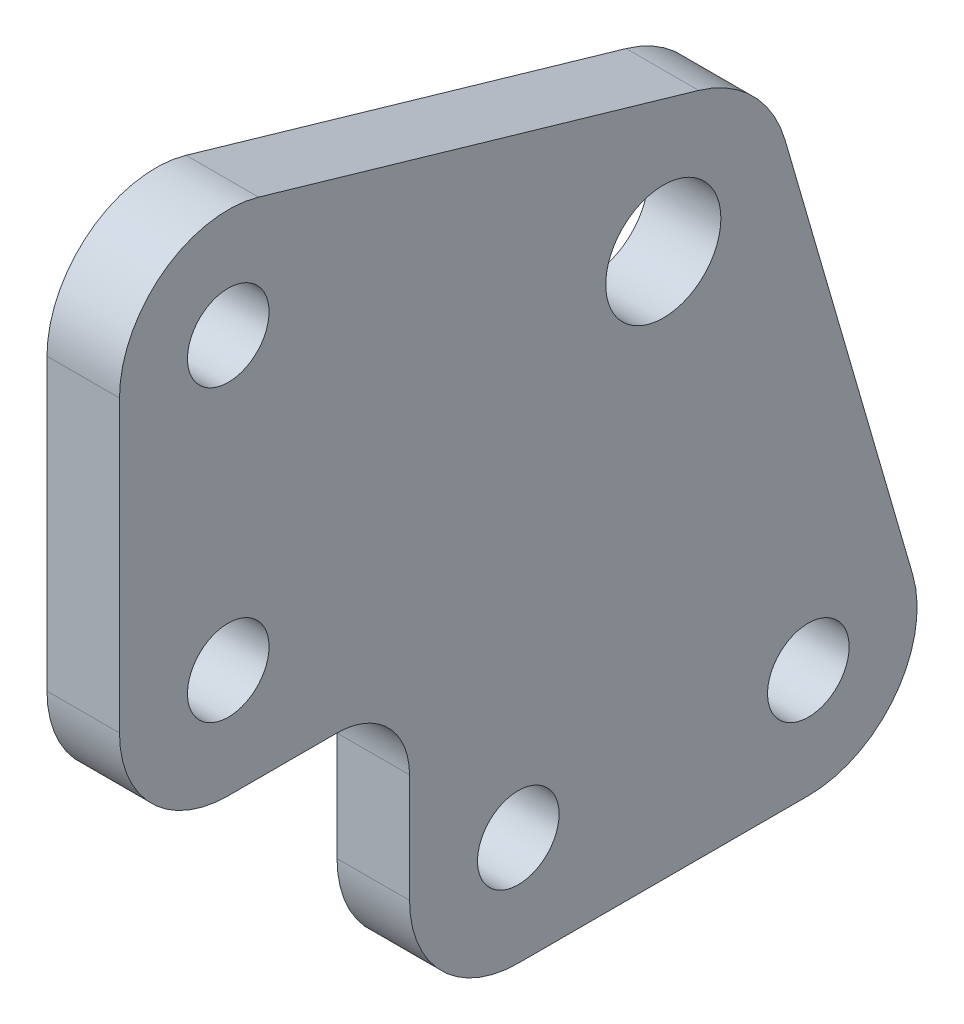
ISO-10303-21;
HEADER;
FILE_DESCRIPTION(('STEP AP214'),'2;1');
FILE_NAME('part.step','',(''),(''),'','','');
FILE_SCHEMA(('AUTOMOTIVE_DESIGN { 1 0 10303 214 1 1 1 1 }'));
ENDSEC;
DATA;
#1=APPLICATION_CONTEXT('core data for automotive mechanical design processes');
#2=APPLICATION_PROTOCOL_DEFINITION('international standard','automotive_design',2000,#1);
#3=PRODUCT_CONTEXT('',#1,'mechanical');
#4=PRODUCT('Part','Part','',(#3));
#5=PRODUCT_RELATED_PRODUCT_CATEGORY('part','',(#4));
#6=PRODUCT_DEFINITION_FORMATION('','',#4);
#7=PRODUCT_DEFINITION_CONTEXT('part definition',#1,'design');
#8=PRODUCT_DEFINITION('design','',#6,#7);
#9=PRODUCT_DEFINITION_SHAPE('','',#8);
#10=(LENGTH_UNIT() NAMED_UNIT(*) SI_UNIT(.MILLI.,.METRE.));
#11=(NAMED_UNIT(*) PLANE_ANGLE_UNIT() SI_UNIT($,.RADIAN.));
#12=(NAMED_UNIT(*) SI_UNIT($,.STERADIAN.) SOLID_ANGLE_UNIT());
#13=UNCERTAINTY_MEASURE_WITH_UNIT(LENGTH_MEASURE(1.E-05),#10,'distance_accuracy_value','');
#14=(GEOMETRIC_REPRESENTATION_CONTEXT(3) GLOBAL_UNCERTAINTY_ASSIGNED_CONTEXT((#13)) GLOBAL_UNIT_ASSIGNED_CONTEXT((#10,
#11,#12)) REPRESENTATION_CONTEXT('',''));
#15=CARTESIAN_POINT('',(0.,0.,0.));
#16=DIRECTION('',(0.,0.,1.));
#17=DIRECTION('',(1.,0.,0.));
#18=AXIS2_PLACEMENT_3D('',#15,#16,#17);
#19=CARTESIAN_POINT('',(18.738912484,195.704574554,1328.475334154));
#20=DIRECTION('',(-1.,0.,0.));
#21=DIRECTION('',(0.,0.,1.));
#22=AXIS2_PLACEMENT_3D('',#19,#20,#21);
#23=CYLINDRICAL_SURFACE('',#22,9.52500000000001);
#24=CARTESIAN_POINT('',(12.388912484,195.704574554,1328.475334154));
#25=DIRECTION('',(1.,0.,0.));
#26=DIRECTION('',(0.,0.,-1.));
#27=AXIS2_PLACEMENT_3D('',#24,#25,#26);
#28=CIRCLE('',#27,9.52500000000001);
#29=CARTESIAN_POINT('',(12.388912484,204.85278317032,1325.82280628189));
#30=VERTEX_POINT('',#29);
#31=CARTESIAN_POINT('',(12.388912484,195.704574554,1338.000334154));
#32=VERTEX_POINT('',#31);
#33=EDGE_CURVE('E151',#30,#32,#28,.T.);
#34=ORIENTED_EDGE('',*,*,#33,.T.);
#35=DIRECTION('',(-1.,0.,0.));
#36=VECTOR('',#35,1.);
#37=CARTESIAN_POINT('',(18.738912484,195.704574554,1338.000334154));
#38=LINE('',#37,#36);
#39=CARTESIAN_POINT('',(18.738912484,195.704574554,1338.000334154));
#40=VERTEX_POINT('',#39);
#41=EDGE_CURVE('E132',#40,#32,#38,.T.);
#42=ORIENTED_EDGE('',*,*,#41,.F.);
#43=CARTESIAN_POINT('',(18.738912484,195.704574554,1328.475334154));
#44=DIRECTION('',(1.,0.,0.));
#45=DIRECTION('',(0.,0.,-1.));
#46=AXIS2_PLACEMENT_3D('',#43,#44,#45);
#47=CIRCLE('',#46,9.52500000000001);
#48=CARTESIAN_POINT('',(18.738912484,204.85278317032,1325.82280628189));
#49=VERTEX_POINT('',#48);
#50=EDGE_CURVE('E139',#49,#40,#47,.T.);
#51=ORIENTED_EDGE('',*,*,#50,.F.);
#52=DIRECTION('',(-1.,0.,0.));
#53=VECTOR('',#52,1.);
#54=CARTESIAN_POINT('',(18.738912484,204.85278317032,1325.82280628189));
#55=LINE('',#54,#53);
#56=EDGE_CURVE('E180',#49,#30,#55,.T.);
#57=ORIENTED_EDGE('',*,*,#56,.T.);
#58=EDGE_LOOP('',(#34,#42,#51,#57));
#59=FACE_BOUND('',#58,.T.);
#60=ADVANCED_FACE('F39',(#59),#23,.T.);
#61=CARTESIAN_POINT('',(18.738912484,195.704574554,1338.000334154));
#62=DIRECTION('',(0.,0.,-1.));
#63=DIRECTION('',(-1.,0.,0.));
#64=AXIS2_PLACEMENT_3D('',#61,#62,#63);
#65=PLANE('',#64);
#66=DIRECTION('',(0.,-1.,0.));
#67=VECTOR('',#66,1.);
#68=CARTESIAN_POINT('',(12.388912484,195.704574554,1338.000334154));
#69=LINE('',#68,#67);
#70=CARTESIAN_POINT('',(12.388912484,170.304574554,1338.000334154));
#71=VERTEX_POINT('',#70);
#72=EDGE_CURVE('E199',#32,#71,#69,.T.);
#73=ORIENTED_EDGE('',*,*,#72,.T.);
#74=DIRECTION('',(-1.,0.,0.));
#75=VECTOR('',#74,1.);
#76=CARTESIAN_POINT('',(18.738912484,170.304574554,1338.000334154));
#77=LINE('',#76,#75);
#78=CARTESIAN_POINT('',(18.738912484,170.304574554,1338.000334154));
#79=VERTEX_POINT('',#78);
#80=EDGE_CURVE('E135',#79,#71,#77,.T.);
#81=ORIENTED_EDGE('',*,*,#80,.F.);
#82=DIRECTION('',(0.,-1.,0.));
#83=VECTOR('',#82,1.);
#84=CARTESIAN_POINT('',(18.738912484,195.704574554,1338.000334154));
#85=LINE('',#84,#83);
#86=EDGE_CURVE('E128',#40,#79,#85,.T.);
#87=ORIENTED_EDGE('',*,*,#86,.F.);
#88=ORIENTED_EDGE('',*,*,#41,.T.);
#89=EDGE_LOOP('',(#73,#81,#87,#88));
#90=FACE_BOUND('',#89,.T.);
#91=ADVANCED_FACE('F130',(#90),#65,.F.);
#92=CARTESIAN_POINT('',(18.738912484,170.304574554,1328.475334154));
#93=DIRECTION('',(-1.,0.,0.));
#94=DIRECTION('',(0.,0.,1.));
#95=AXIS2_PLACEMENT_3D('',#92,#93,#94);
#96=CYLINDRICAL_SURFACE('',#95,9.52499999999999);
#97=CARTESIAN_POINT('',(12.388912484,170.304574554,1328.475334154));
#98=DIRECTION('',(1.,0.,0.));
#99=DIRECTION('',(0.,0.,-1.));
#100=AXIS2_PLACEMENT_3D('',#97,#98,#99);
#101=CIRCLE('',#100,9.52499999999999);
#102=CARTESIAN_POINT('',(12.388912484,160.779574554,1328.475334154));
#103=VERTEX_POINT('',#102);
#104=EDGE_CURVE('E197',#71,#103,#101,.T.);
#105=ORIENTED_EDGE('',*,*,#104,.T.);
#106=DIRECTION('',(-1.,0.,0.));
#107=VECTOR('',#106,1.);
#108=CARTESIAN_POINT('',(18.738912484,160.779574554,1328.475334154));
#109=LINE('',#108,#107);
#110=CARTESIAN_POINT('',(18.738912484,160.779574554,1328.475334154));
#111=VERTEX_POINT('',#110);
#112=EDGE_CURVE('E156',#111,#103,#109,.T.);
#113=ORIENTED_EDGE('',*,*,#112,.F.);
#114=CARTESIAN_POINT('',(18.738912484,170.304574554,1328.475334154));
#115=DIRECTION('',(1.,0.,0.));
#116=DIRECTION('',(0.,0.,-1.));
#117=AXIS2_PLACEMENT_3D('',#114,#115,#116);
#118=CIRCLE('',#117,9.52499999999999);
#119=EDGE_CURVE('E138',#79,#111,#118,.T.);
#120=ORIENTED_EDGE('',*,*,#119,.F.);
#121=ORIENTED_EDGE('',*,*,#80,.T.);
#122=EDGE_LOOP('',(#105,#113,#120,#121));
#123=FACE_BOUND('',#122,.T.);
#124=ADVANCED_FACE('F284',(#123),#96,.T.);
#125=CARTESIAN_POINT('',(18.738912484,160.779574554,1328.475334154));
#126=DIRECTION('',(0.,1.,0.));
#127=DIRECTION('',(0.,0.,1.));
#128=AXIS2_PLACEMENT_3D('',#125,#126,#127);
#129=PLANE('',#128);
#130=DIRECTION('',(0.,0.,-1.));
#131=VECTOR('',#130,1.);
#132=CARTESIAN_POINT('',(12.388912484,160.779574554,1328.475334154));
#133=LINE('',#132,#131);
#134=CARTESIAN_POINT('',(12.388912484,160.779574554,1318.950334154));
#135=VERTEX_POINT('',#134);
#136=EDGE_CURVE('E195',#103,#135,#133,.T.);
#137=ORIENTED_EDGE('',*,*,#136,.T.);
#138=DIRECTION('',(-1.,0.,0.));
#139=VECTOR('',#138,1.);
#140=CARTESIAN_POINT('',(18.738912484,160.779574554,1318.950334154));
#141=LINE('',#140,#139);
#142=CARTESIAN_POINT('',(18.738912484,160.779574554,1318.950334154));
#143=VERTEX_POINT('',#142);
#144=EDGE_CURVE('E54',#135,#143,#141,.F.);
#145=ORIENTED_EDGE('',*,*,#144,.T.);
#146=DIRECTION('',(0.,0.,-1.));
#147=VECTOR('',#146,1.);
#148=CARTESIAN_POINT('',(18.738912484,160.779574554,1328.475334154));
#149=LINE('',#148,#147);
#150=EDGE_CURVE('E216',#111,#143,#149,.T.);
#151=ORIENTED_EDGE('',*,*,#150,.F.);
#152=ORIENTED_EDGE('',*,*,#112,.T.);
#153=EDGE_LOOP('',(#137,#145,#151,#152));
#154=FACE_BOUND('',#153,.T.);
#155=ADVANCED_FACE('F289',(#154),#129,.F.);
#156=CARTESIAN_POINT('',(18.738912484,160.779574554,1312.600334154));
#157=DIRECTION('',(0.,0.,-1.));
#158=DIRECTION('',(-1.,0.,0.));
#159=AXIS2_PLACEMENT_3D('',#156,#157,#158);
#160=PLANE('',#159);
#161=DIRECTION('',(0.,-1.,0.));
#162=VECTOR('',#161,1.);
#163=CARTESIAN_POINT('',(18.738912484,160.779574554,1312.600334154));
#164=LINE('',#163,#162);
#165=CARTESIAN_POINT('',(18.738912484,154.429574554,1312.600334154));
#166=VERTEX_POINT('',#165);
#167=CARTESIAN_POINT('',(18.738912484,144.904574554,1312.600334154));
#168=VERTEX_POINT('',#167);
#169=EDGE_CURVE('E214',#166,#168,#164,.T.);
#170=ORIENTED_EDGE('',*,*,#169,.F.);
#171=DIRECTION('',(-1.,0.,0.));
#172=VECTOR('',#171,1.);
#173=CARTESIAN_POINT('',(12.388912484,154.429574554,1312.600334154));
#174=LINE('',#173,#172);
#175=CARTESIAN_POINT('',(12.388912484,154.429574554,1312.600334154));
#176=VERTEX_POINT('',#175);
#177=EDGE_CURVE('E152',#166,#176,#174,.T.);
#178=ORIENTED_EDGE('',*,*,#177,.T.);
#179=DIRECTION('',(0.,-1.,0.));
#180=VECTOR('',#179,1.);
#181=CARTESIAN_POINT('',(12.388912484,160.779574554,1312.600334154));
#182=LINE('',#181,#180);
#183=CARTESIAN_POINT('',(12.388912484,144.904574554,1312.600334154));
#184=VERTEX_POINT('',#183);
#185=EDGE_CURVE('E193',#176,#184,#182,.T.);
#186=ORIENTED_EDGE('',*,*,#185,.T.);
#187=DIRECTION('',(-1.,0.,0.));
#188=VECTOR('',#187,1.);
#189=CARTESIAN_POINT('',(18.738912484,144.904574554,1312.600334154));
#190=LINE('',#189,#188);
#191=EDGE_CURVE('E162',#168,#184,#190,.T.);
#192=ORIENTED_EDGE('',*,*,#191,.F.);
#193=EDGE_LOOP('',(#170,#178,#186,#192));
#194=FACE_BOUND('',#193,.T.);
#195=ADVANCED_FACE('F293',(#194),#160,.F.);
#196=CARTESIAN_POINT('',(18.738912484,144.904574554,1303.075334154));
#197=DIRECTION('',(-1.,0.,0.));
#198=DIRECTION('',(0.,0.,1.));
#199=AXIS2_PLACEMENT_3D('',#196,#197,#198);
#200=CYLINDRICAL_SURFACE('',#199,9.52500000000001);
#201=CARTESIAN_POINT('',(12.388912484,144.904574554,1303.075334154));
#202=DIRECTION('',(1.,0.,0.));
#203=DIRECTION('',(0.,0.,-1.));
#204=AXIS2_PLACEMENT_3D('',#201,#202,#203);
#205=CIRCLE('',#204,9.52500000000001);
#206=CARTESIAN_POINT('',(12.388912484,135.379574554,1303.075334154));
#207=VERTEX_POINT('',#206);
#208=EDGE_CURVE('E191',#184,#207,#205,.T.);
#209=ORIENTED_EDGE('',*,*,#208,.T.);
#210=DIRECTION('',(-1.,0.,0.));
#211=VECTOR('',#210,1.);
#212=CARTESIAN_POINT('',(18.738912484,135.379574554,1303.075334154));
#213=LINE('',#212,#211);
#214=CARTESIAN_POINT('',(18.738912484,135.379574554,1303.075334154));
#215=VERTEX_POINT('',#214);
#216=EDGE_CURVE('E165',#215,#207,#213,.T.);
#217=ORIENTED_EDGE('',*,*,#216,.F.);
#218=CARTESIAN_POINT('',(18.738912484,144.904574554,1303.075334154));
#219=DIRECTION('',(1.,0.,0.));
#220=DIRECTION('',(0.,0.,-1.));
#221=AXIS2_PLACEMENT_3D('',#218,#219,#220);
#222=CIRCLE('',#221,9.52500000000001);
#223=EDGE_CURVE('E212',#168,#215,#222,.T.);
#224=ORIENTED_EDGE('',*,*,#223,.F.);
#225=ORIENTED_EDGE('',*,*,#191,.T.);
#226=EDGE_LOOP('',(#209,#217,#224,#225));
#227=FACE_BOUND('',#226,.T.);
#228=ADVANCED_FACE('F296',(#227),#200,.T.);
#229=CARTESIAN_POINT('',(18.738912484,135.379574554,1303.075334154));
#230=DIRECTION('',(0.,1.,0.));
#231=DIRECTION('',(0.,0.,1.));
#232=AXIS2_PLACEMENT_3D('',#229,#230,#231);
#233=PLANE('',#232);
#234=DIRECTION('',(0.,0.,-1.));
#235=VECTOR('',#234,1.);
#236=CARTESIAN_POINT('',(12.388912484,135.379574554,1303.075334154));
#237=LINE('',#236,#235);
#238=CARTESIAN_POINT('',(12.388912484,135.379574554,1277.675334154));
#239=VERTEX_POINT('',#238);
#240=EDGE_CURVE('E189',#207,#239,#237,.T.);
#241=ORIENTED_EDGE('',*,*,#240,.T.);
#242=DIRECTION('',(-1.,0.,0.));
#243=VECTOR('',#242,1.);
#244=CARTESIAN_POINT('',(18.738912484,135.379574554,1277.675334154));
#245=LINE('',#244,#243);
#246=CARTESIAN_POINT('',(18.738912484,135.379574554,1277.675334154));
#247=VERTEX_POINT('',#246);
#248=EDGE_CURVE('E168',#247,#239,#245,.T.);
#249=ORIENTED_EDGE('',*,*,#248,.F.);
#250=DIRECTION('',(0.,0.,-1.));
#251=VECTOR('',#250,1.);
#252=CARTESIAN_POINT('',(18.738912484,135.379574554,1303.075334154));
#253=LINE('',#252,#251);
#254=EDGE_CURVE('E210',#215,#247,#253,.T.);
#255=ORIENTED_EDGE('',*,*,#254,.F.);
#256=ORIENTED_EDGE('',*,*,#216,.T.);
#257=EDGE_LOOP('',(#241,#249,#255,#256));
#258=FACE_BOUND('',#257,.T.);
#259=ADVANCED_FACE('F300',(#258),#233,.F.);
#260=CARTESIAN_POINT('',(18.738912484,144.904574554,1277.675334154));
#261=DIRECTION('',(-1.,0.,0.));
#262=DIRECTION('',(0.,0.,1.));
#263=AXIS2_PLACEMENT_3D('',#260,#261,#262);
#264=CYLINDRICAL_SURFACE('',#263,9.52499999999996);
#265=CARTESIAN_POINT('',(12.388912484,144.904574554,1277.675334154));
#266=DIRECTION('',(1.,0.,0.));
#267=DIRECTION('',(0.,0.,-1.));
#268=AXIS2_PLACEMENT_3D('',#265,#266,#267);
#269=CIRCLE('',#268,9.52499999999996);
#270=CARTESIAN_POINT('',(12.388912484,147.557102426107,1268.52712553768));
#271=VERTEX_POINT('',#270);
#272=EDGE_CURVE('E187',#239,#271,#269,.T.);
#273=ORIENTED_EDGE('',*,*,#272,.T.);
#274=DIRECTION('',(-1.,0.,0.));
#275=VECTOR('',#274,1.);
#276=CARTESIAN_POINT('',(18.738912484,147.557102426107,1268.52712553768));
#277=LINE('',#276,#275);
#278=CARTESIAN_POINT('',(18.738912484,147.557102426107,1268.52712553768));
#279=VERTEX_POINT('',#278);
#280=EDGE_CURVE('E171',#279,#271,#277,.T.);
#281=ORIENTED_EDGE('',*,*,#280,.F.);
#282=CARTESIAN_POINT('',(18.738912484,144.904574554,1277.675334154));
#283=DIRECTION('',(1.,0.,0.));
#284=DIRECTION('',(0.,0.,-1.));
#285=AXIS2_PLACEMENT_3D('',#282,#283,#284);
#286=CIRCLE('',#285,9.52499999999996);
#287=EDGE_CURVE('E208',#247,#279,#286,.T.);
#288=ORIENTED_EDGE('',*,*,#287,.F.);
#289=ORIENTED_EDGE('',*,*,#248,.T.);
#290=EDGE_LOOP('',(#273,#281,#288,#289));
#291=FACE_BOUND('',#290,.T.);
#292=ADVANCED_FACE('F304',(#291),#264,.T.);
#293=CARTESIAN_POINT('',(18.738912484,186.099190404791,1279.70242410163));
#294=DIRECTION('',(0.,-0.278480616494109,0.960441849482342));
#295=DIRECTION('',(0.,-0.960441849482342,-0.278480616494109));
#296=AXIS2_PLACEMENT_3D('',#293,#294,#295);
#297=PLANE('',#296);
#298=DIRECTION('',(0.,0.960441849482342,0.278480616494109));
#299=VECTOR('',#298,1.);
#300=CARTESIAN_POINT('',(12.388912484,186.099190404791,1279.70242410163));
#301=LINE('',#300,#299);
#302=CARTESIAN_POINT('',(12.388912484,186.099190404791,1279.70242410163));
#303=VERTEX_POINT('',#302);
#304=EDGE_CURVE('E185',#271,#303,#301,.T.);
#305=ORIENTED_EDGE('',*,*,#304,.T.);
#306=DIRECTION('',(-1.,0.,0.));
#307=VECTOR('',#306,1.);
#308=CARTESIAN_POINT('',(18.738912484,186.099190404791,1279.70242410163));
#309=LINE('',#308,#307);
#310=CARTESIAN_POINT('',(18.738912484,186.099190404791,1279.70242410163));
#311=VERTEX_POINT('',#310);
#312=EDGE_CURVE('E174',#311,#303,#309,.T.);
#313=ORIENTED_EDGE('',*,*,#312,.F.);
#314=DIRECTION('',(0.,0.960441849482342,0.278480616494109));
#315=VECTOR('',#314,1.);
#316=CARTESIAN_POINT('',(18.738912484,186.099190404791,1279.70242410163));
#317=LINE('',#316,#315);
#318=EDGE_CURVE('E206',#279,#311,#317,.T.);
#319=ORIENTED_EDGE('',*,*,#318,.F.);
#320=ORIENTED_EDGE('',*,*,#280,.T.);
#321=EDGE_LOOP('',(#305,#313,#319,#320));
#322=FACE_BOUND('',#321,.T.);
#323=ADVANCED_FACE('F308',(#322),#297,.F.);
#324=CARTESIAN_POINT('',(18.738912484,183.004574554,1290.375334154));
#325=DIRECTION('',(-1.,0.,0.));
#326=DIRECTION('',(0.,0.,1.));
#327=AXIS2_PLACEMENT_3D('',#324,#325,#326);
#328=CYLINDRICAL_SURFACE('',#327,11.1125000000001);
#329=CARTESIAN_POINT('',(12.388912484,183.004574554,1290.375334154));
#330=DIRECTION('',(1.,0.,0.));
#331=DIRECTION('',(0.,0.,-1.));
#332=AXIS2_PLACEMENT_3D('',#329,#330,#331);
#333=CIRCLE('',#332,11.1125000000001);
#334=CARTESIAN_POINT('',(12.388912484,193.677484606373,1287.28071830321));
#335=VERTEX_POINT('',#334);
#336=EDGE_CURVE('E183',#303,#335,#333,.T.);
#337=ORIENTED_EDGE('',*,*,#336,.T.);
#338=DIRECTION('',(-1.,0.,0.));
#339=VECTOR('',#338,1.);
#340=CARTESIAN_POINT('',(18.738912484,193.677484606373,1287.28071830321));
#341=LINE('',#340,#339);
#342=CARTESIAN_POINT('',(18.738912484,193.677484606373,1287.28071830321));
#343=VERTEX_POINT('',#342);
#344=EDGE_CURVE('E177',#343,#335,#341,.T.);
#345=ORIENTED_EDGE('',*,*,#344,.F.);
#346=CARTESIAN_POINT('',(18.738912484,183.004574554,1290.375334154));
#347=DIRECTION('',(1.,0.,0.));
#348=DIRECTION('',(0.,0.,-1.));
#349=AXIS2_PLACEMENT_3D('',#346,#347,#348);
#350=CIRCLE('',#349,11.1125000000001);
#351=EDGE_CURVE('E204',#311,#343,#350,.T.);
#352=ORIENTED_EDGE('',*,*,#351,.F.);
#353=ORIENTED_EDGE('',*,*,#312,.T.);
#354=EDGE_LOOP('',(#337,#345,#352,#353));
#355=FACE_BOUND('',#354,.T.);
#356=ADVANCED_FACE('F312',(#355),#328,.T.);
#357=CARTESIAN_POINT('',(18.738912484,204.85278317032,1325.82280628189));
#358=DIRECTION('',(0.,-0.960441849482341,0.27848061649411));
#359=DIRECTION('',(0.,-0.27848061649411,-0.960441849482341));
#360=AXIS2_PLACEMENT_3D('',#357,#358,#359);
#361=PLANE('',#360);
#362=DIRECTION('',(0.,0.27848061649411,0.960441849482341));
#363=VECTOR('',#362,1.);
#364=CARTESIAN_POINT('',(12.388912484,204.85278317032,1325.82280628189));
#365=LINE('',#364,#363);
#366=EDGE_CURVE('E148',#335,#30,#365,.T.);
#367=ORIENTED_EDGE('',*,*,#366,.T.);
#368=ORIENTED_EDGE('',*,*,#56,.F.);
#369=DIRECTION('',(0.,0.27848061649411,0.960441849482341));
#370=VECTOR('',#369,1.);
#371=CARTESIAN_POINT('',(18.738912484,204.85278317032,1325.82280628189));
#372=LINE('',#371,#370);
#373=EDGE_CURVE('E144',#343,#49,#372,.T.);
#374=ORIENTED_EDGE('',*,*,#373,.F.);
#375=ORIENTED_EDGE('',*,*,#344,.T.);
#376=EDGE_LOOP('',(#367,#368,#374,#375));
#377=FACE_BOUND('',#376,.T.);
#378=ADVANCED_FACE('F254',(#377),#361,.F.);
#379=CARTESIAN_POINT('',(18.738912484,195.704574554,1328.475334154));
#380=DIRECTION('',(1.,0.,0.));
#381=DIRECTION('',(0.,0.,-1.));
#382=AXIS2_PLACEMENT_3D('',#379,#380,#381);
#383=PLANE('',#382);
#384=CARTESIAN_POINT('',(18.738912484,144.904574554,1303.075334154));
#385=DIRECTION('',(1.,0.,0.));
#386=DIRECTION('',(0.,0.,-1.));
#387=AXIS2_PLACEMENT_3D('',#384,#385,#386);
#388=CIRCLE('',#387,3.57124);
#389=CARTESIAN_POINT('',(18.738912484,144.904574554,1299.504094154));
#390=VERTEX_POINT('',#389);
#391=EDGE_CURVE('E245',#390,#390,#388,.T.);
#392=ORIENTED_EDGE('',*,*,#391,.F.);
#393=EDGE_LOOP('',(#392));
#394=FACE_BOUND('',#393,.T.);
#395=CARTESIAN_POINT('',(18.738912484,144.904574554,1277.675334154));
#396=DIRECTION('',(1.,0.,0.));
#397=DIRECTION('',(0.,0.,-1.));
#398=AXIS2_PLACEMENT_3D('',#395,#396,#397);
#399=CIRCLE('',#398,3.57124);
#400=CARTESIAN_POINT('',(18.738912484,144.904574554,1274.104094154));
#401=VERTEX_POINT('',#400);
#402=EDGE_CURVE('E239',#401,#401,#399,.T.);
#403=ORIENTED_EDGE('',*,*,#402,.F.);
#404=EDGE_LOOP('',(#403));
#405=FACE_BOUND('',#404,.T.);
#406=CARTESIAN_POINT('',(18.738912484,170.304574554,1328.475334154));
#407=DIRECTION('',(1.,0.,0.));
#408=DIRECTION('',(0.,0.,-1.));
#409=AXIS2_PLACEMENT_3D('',#406,#407,#408);
#410=CIRCLE('',#409,3.57124);
#411=CARTESIAN_POINT('',(18.738912484,170.304574554,1324.904094154));
#412=VERTEX_POINT('',#411);
#413=EDGE_CURVE('E233',#412,#412,#410,.T.);
#414=ORIENTED_EDGE('',*,*,#413,.F.);
#415=EDGE_LOOP('',(#414));
#416=FACE_BOUND('',#415,.T.);
#417=CARTESIAN_POINT('',(18.738912484,195.704574554,1328.475334154));
#418=DIRECTION('',(1.,0.,0.));
#419=DIRECTION('',(0.,0.,-1.));
#420=AXIS2_PLACEMENT_3D('',#417,#418,#419);
#421=CIRCLE('',#420,3.57124);
#422=CARTESIAN_POINT('',(18.738912484,195.704574554,1324.904094154));
#423=VERTEX_POINT('',#422);
#424=EDGE_CURVE('E227',#423,#423,#421,.T.);
#425=ORIENTED_EDGE('',*,*,#424,.F.);
#426=EDGE_LOOP('',(#425));
#427=FACE_BOUND('',#426,.T.);
#428=CARTESIAN_POINT('',(18.738912484,183.004574554,1290.375334154));
#429=DIRECTION('',(1.,0.,0.));
#430=DIRECTION('',(0.,0.,-1.));
#431=AXIS2_PLACEMENT_3D('',#428,#429,#430);
#432=CIRCLE('',#431,5.04189999999999);
#433=CARTESIAN_POINT('',(18.738912484,183.004574554,1285.333434154));
#434=VERTEX_POINT('',#433);
#435=EDGE_CURVE('E221',#434,#434,#432,.T.);
#436=ORIENTED_EDGE('',*,*,#435,.F.);
#437=EDGE_LOOP('',(#436));
#438=FACE_BOUND('',#437,.T.);
#439=ORIENTED_EDGE('',*,*,#50,.T.);
#440=ORIENTED_EDGE('',*,*,#86,.T.);
#441=ORIENTED_EDGE('',*,*,#119,.T.);
#442=ORIENTED_EDGE('',*,*,#150,.T.);
#443=CARTESIAN_POINT('',(18.738912484,154.429574554,1318.950334154));
#444=DIRECTION('',(1.,0.,0.));
#445=DIRECTION('',(0.,0.,-1.));
#446=AXIS2_PLACEMENT_3D('',#443,#444,#445);
#447=CIRCLE('',#446,6.35);
#448=EDGE_CURVE('E11',#143,#166,#447,.F.);
#449=ORIENTED_EDGE('',*,*,#448,.T.);
#450=ORIENTED_EDGE('',*,*,#169,.T.);
#451=ORIENTED_EDGE('',*,*,#223,.T.);
#452=ORIENTED_EDGE('',*,*,#254,.T.);
#453=ORIENTED_EDGE('',*,*,#287,.T.);
#454=ORIENTED_EDGE('',*,*,#318,.T.);
#455=ORIENTED_EDGE('',*,*,#351,.T.);
#456=ORIENTED_EDGE('',*,*,#373,.T.);
#457=EDGE_LOOP('',(#439,#440,#441,#442,#449,#450,#451,#452,#453,#454,#455,#456));
#458=FACE_BOUND('',#457,.T.);
#459=ADVANCED_FACE('F142',(#394,#405,#416,#427,#438,#458),#383,.T.);
#460=CARTESIAN_POINT('',(12.388912484,195.704574554,1328.475334154));
#461=DIRECTION('',(1.,0.,0.));
#462=DIRECTION('',(0.,0.,-1.));
#463=AXIS2_PLACEMENT_3D('',#460,#461,#462);
#464=PLANE('',#463);
#465=CARTESIAN_POINT('',(12.388912484,144.904574554,1303.075334154));
#466=DIRECTION('',(1.,0.,0.));
#467=DIRECTION('',(0.,0.,-1.));
#468=AXIS2_PLACEMENT_3D('',#465,#466,#467);
#469=CIRCLE('',#468,3.57124);
#470=CARTESIAN_POINT('',(12.388912484,144.904574554,1299.504094154));
#471=VERTEX_POINT('',#470);
#472=EDGE_CURVE('E242',#471,#471,#469,.T.);
#473=ORIENTED_EDGE('',*,*,#472,.T.);
#474=EDGE_LOOP('',(#473));
#475=FACE_BOUND('',#474,.T.);
#476=CARTESIAN_POINT('',(12.388912484,144.904574554,1277.675334154));
#477=DIRECTION('',(1.,0.,0.));
#478=DIRECTION('',(0.,0.,-1.));
#479=AXIS2_PLACEMENT_3D('',#476,#477,#478);
#480=CIRCLE('',#479,3.57124);
#481=CARTESIAN_POINT('',(12.388912484,144.904574554,1274.104094154));
#482=VERTEX_POINT('',#481);
#483=EDGE_CURVE('E236',#482,#482,#480,.T.);
#484=ORIENTED_EDGE('',*,*,#483,.T.);
#485=EDGE_LOOP('',(#484));
#486=FACE_BOUND('',#485,.T.);
#487=CARTESIAN_POINT('',(12.388912484,170.304574554,1328.475334154));
#488=DIRECTION('',(1.,0.,0.));
#489=DIRECTION('',(0.,0.,-1.));
#490=AXIS2_PLACEMENT_3D('',#487,#488,#489);
#491=CIRCLE('',#490,3.57124);
#492=CARTESIAN_POINT('',(12.388912484,170.304574554,1324.904094154));
#493=VERTEX_POINT('',#492);
#494=EDGE_CURVE('E230',#493,#493,#491,.T.);
#495=ORIENTED_EDGE('',*,*,#494,.T.);
#496=EDGE_LOOP('',(#495));
#497=FACE_BOUND('',#496,.T.);
#498=CARTESIAN_POINT('',(12.388912484,195.704574554,1328.475334154));
#499=DIRECTION('',(1.,0.,0.));
#500=DIRECTION('',(0.,0.,-1.));
#501=AXIS2_PLACEMENT_3D('',#498,#499,#500);
#502=CIRCLE('',#501,3.57124);
#503=CARTESIAN_POINT('',(12.388912484,195.704574554,1324.904094154));
#504=VERTEX_POINT('',#503);
#505=EDGE_CURVE('E224',#504,#504,#502,.T.);
#506=ORIENTED_EDGE('',*,*,#505,.T.);
#507=EDGE_LOOP('',(#506));
#508=FACE_BOUND('',#507,.T.);
#509=CARTESIAN_POINT('',(12.388912484,183.004574554,1290.375334154));
#510=DIRECTION('',(1.,0.,0.));
#511=DIRECTION('',(0.,0.,-1.));
#512=AXIS2_PLACEMENT_3D('',#509,#510,#511);
#513=CIRCLE('',#512,5.04189999999999);
#514=CARTESIAN_POINT('',(12.388912484,183.004574554,1285.333434154));
#515=VERTEX_POINT('',#514);
#516=EDGE_CURVE('E202',#515,#515,#513,.T.);
#517=ORIENTED_EDGE('',*,*,#516,.T.);
#518=EDGE_LOOP('',(#517));
#519=FACE_BOUND('',#518,.T.);
#520=ORIENTED_EDGE('',*,*,#33,.F.);
#521=ORIENTED_EDGE('',*,*,#366,.F.);
#522=ORIENTED_EDGE('',*,*,#336,.F.);
#523=ORIENTED_EDGE('',*,*,#304,.F.);
#524=ORIENTED_EDGE('',*,*,#272,.F.);
#525=ORIENTED_EDGE('',*,*,#240,.F.);
#526=ORIENTED_EDGE('',*,*,#208,.F.);
#527=ORIENTED_EDGE('',*,*,#185,.F.);
#528=CARTESIAN_POINT('',(12.388912484,154.429574554,1318.950334154));
#529=DIRECTION('',(1.,0.,0.));
#530=DIRECTION('',(0.,0.,-1.));
#531=AXIS2_PLACEMENT_3D('',#528,#529,#530);
#532=CIRCLE('',#531,6.35);
#533=EDGE_CURVE('E47',#176,#135,#532,.T.);
#534=ORIENTED_EDGE('',*,*,#533,.T.);
#535=ORIENTED_EDGE('',*,*,#136,.F.);
#536=ORIENTED_EDGE('',*,*,#104,.F.);
#537=ORIENTED_EDGE('',*,*,#72,.F.);
#538=EDGE_LOOP('',(#520,#521,#522,#523,#524,#525,#526,#527,#534,#535,#536,#537));
#539=FACE_BOUND('',#538,.T.);
#540=ADVANCED_FACE('F253',(#475,#486,#497,#508,#519,#539),#464,.F.);
#541=CARTESIAN_POINT('',(18.738912484,183.004574554,1290.375334154));
#542=DIRECTION('',(1.,0.,0.));
#543=DIRECTION('',(0.,0.,-1.));
#544=AXIS2_PLACEMENT_3D('',#541,#542,#543);
#545=CYLINDRICAL_SURFACE('',#544,5.04189999999999);
#546=ORIENTED_EDGE('',*,*,#516,.F.);
#547=EDGE_LOOP('',(#546));
#548=FACE_BOUND('',#547,.T.);
#549=ORIENTED_EDGE('',*,*,#435,.T.);
#550=EDGE_LOOP('',(#549));
#551=FACE_BOUND('',#550,.T.);
#552=ADVANCED_FACE('F264',(#548,#551),#545,.F.);
#553=CARTESIAN_POINT('',(18.738912484,195.704574554,1328.475334154));
#554=DIRECTION('',(1.,0.,0.));
#555=DIRECTION('',(0.,0.,-1.));
#556=AXIS2_PLACEMENT_3D('',#553,#554,#555);
#557=CYLINDRICAL_SURFACE('',#556,3.57124);
#558=ORIENTED_EDGE('',*,*,#505,.F.);
#559=EDGE_LOOP('',(#558));
#560=FACE_BOUND('',#559,.T.);
#561=ORIENTED_EDGE('',*,*,#424,.T.);
#562=EDGE_LOOP('',(#561));
#563=FACE_BOUND('',#562,.T.);
#564=ADVANCED_FACE('F266',(#560,#563),#557,.F.);
#565=CARTESIAN_POINT('',(18.738912484,170.304574554,1328.475334154));
#566=DIRECTION('',(1.,0.,0.));
#567=DIRECTION('',(0.,0.,-1.));
#568=AXIS2_PLACEMENT_3D('',#565,#566,#567);
#569=CYLINDRICAL_SURFACE('',#568,3.57124);
#570=ORIENTED_EDGE('',*,*,#494,.F.);
#571=EDGE_LOOP('',(#570));
#572=FACE_BOUND('',#571,.T.);
#573=ORIENTED_EDGE('',*,*,#413,.T.);
#574=EDGE_LOOP('',(#573));
#575=FACE_BOUND('',#574,.T.);
#576=ADVANCED_FACE('F273',(#572,#575),#569,.F.);
#577=CARTESIAN_POINT('',(18.738912484,144.904574554,1277.675334154));
#578=DIRECTION('',(1.,0.,0.));
#579=DIRECTION('',(0.,0.,-1.));
#580=AXIS2_PLACEMENT_3D('',#577,#578,#579);
#581=CYLINDRICAL_SURFACE('',#580,3.57124);
#582=ORIENTED_EDGE('',*,*,#483,.F.);
#583=EDGE_LOOP('',(#582));
#584=FACE_BOUND('',#583,.T.);
#585=ORIENTED_EDGE('',*,*,#402,.T.);
#586=EDGE_LOOP('',(#585));
#587=FACE_BOUND('',#586,.T.);
#588=ADVANCED_FACE('F347',(#584,#587),#581,.F.);
#589=CARTESIAN_POINT('',(18.738912484,144.904574554,1303.075334154));
#590=DIRECTION('',(1.,0.,0.));
#591=DIRECTION('',(0.,0.,-1.));
#592=AXIS2_PLACEMENT_3D('',#589,#590,#591);
#593=CYLINDRICAL_SURFACE('',#592,3.57124);
#594=ORIENTED_EDGE('',*,*,#472,.F.);
#595=EDGE_LOOP('',(#594));
#596=FACE_BOUND('',#595,.T.);
#597=ORIENTED_EDGE('',*,*,#391,.T.);
#598=EDGE_LOOP('',(#597));
#599=FACE_BOUND('',#598,.T.);
#600=ADVANCED_FACE('F249',(#596,#599),#593,.F.);
#601=CARTESIAN_POINT('',(18.738912484,154.429574554,1318.950334154));
#602=DIRECTION('',(1.,0.,0.));
#603=DIRECTION('',(0.,0.,-1.));
#604=AXIS2_PLACEMENT_3D('',#601,#602,#603);
#605=CYLINDRICAL_SURFACE('',#604,6.35);
#606=ORIENTED_EDGE('',*,*,#448,.F.);
#607=ORIENTED_EDGE('',*,*,#144,.F.);
#608=ORIENTED_EDGE('',*,*,#533,.F.);
#609=ORIENTED_EDGE('',*,*,#177,.F.);
#610=EDGE_LOOP('',(#606,#607,#608,#609));
#611=FACE_BOUND('',#610,.T.);
#612=ADVANCED_FACE('F41',(#611),#605,.F.);
#613=CLOSED_SHELL('',(#60,#91,#124,#155,#195,#228,#259,#292,#323,#356,#378,#459,#540,#552,#564,
#576,#588,#600,#612));
#614=MANIFOLD_SOLID_BREP('B2',#613);
#615=ADVANCED_BREP_SHAPE_REPRESENTATION('',(#18,#614),#14);
#616=SHAPE_DEFINITION_REPRESENTATION(#9,#615);
ENDSEC;
END-ISO-10303-21;
